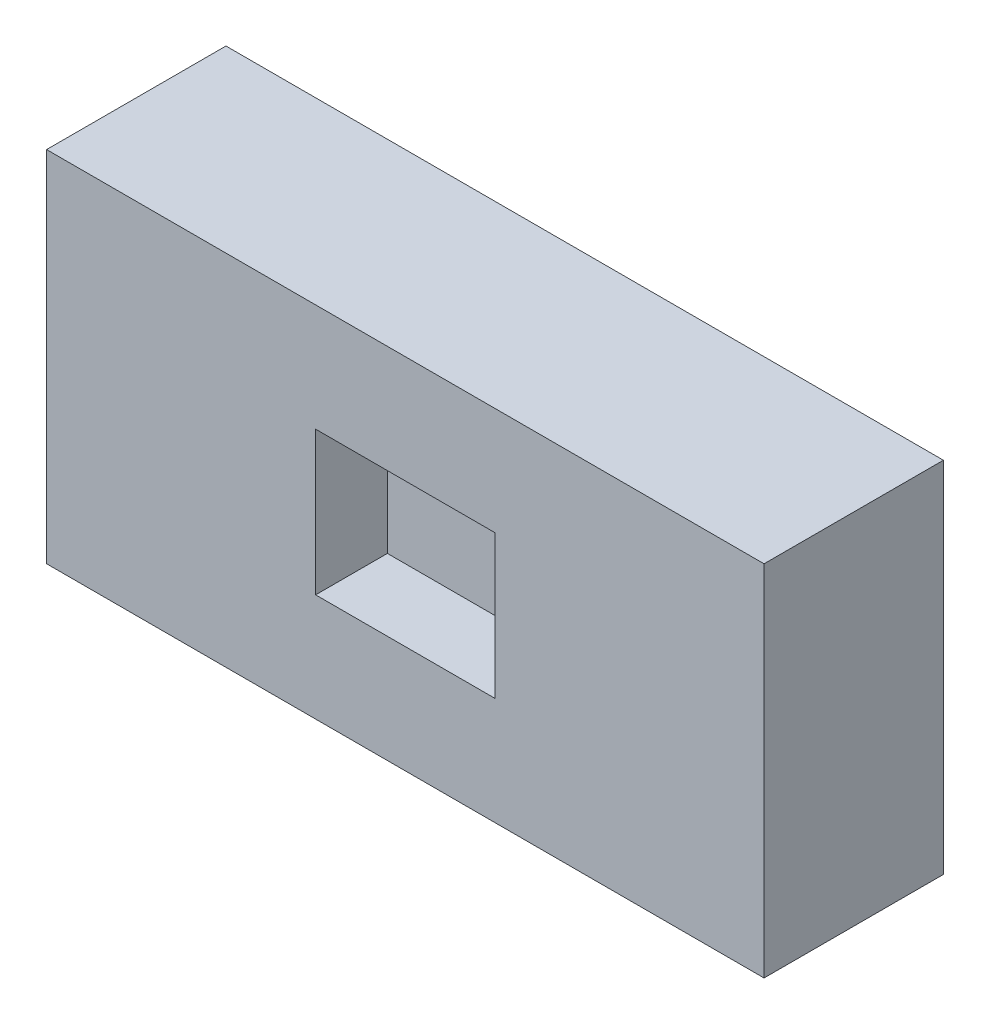
ISO-10303-21;
HEADER;
FILE_DESCRIPTION(('STEP AP214'),'2;1');
FILE_NAME('part.step','',(''),(''),'','','');
FILE_SCHEMA(('AUTOMOTIVE_DESIGN { 1 0 10303 214 1 1 1 1 }'));
ENDSEC;
DATA;
#1=APPLICATION_CONTEXT('core data for automotive mechanical design processes');
#2=APPLICATION_PROTOCOL_DEFINITION('international standard','automotive_design',2000,#1);
#3=PRODUCT_CONTEXT('',#1,'mechanical');
#4=PRODUCT('Part','Part','',(#3));
#5=PRODUCT_RELATED_PRODUCT_CATEGORY('part','',(#4));
#6=PRODUCT_DEFINITION_FORMATION('','',#4);
#7=PRODUCT_DEFINITION_CONTEXT('part definition',#1,'design');
#8=PRODUCT_DEFINITION('design','',#6,#7);
#9=PRODUCT_DEFINITION_SHAPE('','',#8);
#10=(LENGTH_UNIT() NAMED_UNIT(*) SI_UNIT(.MILLI.,.METRE.));
#11=(NAMED_UNIT(*) PLANE_ANGLE_UNIT() SI_UNIT($,.RADIAN.));
#12=(NAMED_UNIT(*) SI_UNIT($,.STERADIAN.) SOLID_ANGLE_UNIT());
#13=UNCERTAINTY_MEASURE_WITH_UNIT(LENGTH_MEASURE(1.E-05),#10,'distance_accuracy_value','');
#14=(GEOMETRIC_REPRESENTATION_CONTEXT(3) GLOBAL_UNCERTAINTY_ASSIGNED_CONTEXT((#13)) GLOBAL_UNIT_ASSIGNED_CONTEXT((#10,
#11,#12)) REPRESENTATION_CONTEXT('',''));
#15=CARTESIAN_POINT('',(0.,0.,0.));
#16=DIRECTION('',(0.,0.,1.));
#17=DIRECTION('',(1.,0.,0.));
#18=AXIS2_PLACEMENT_3D('',#15,#16,#17);
#19=CARTESIAN_POINT('',(0.,0.,10.));
#20=DIRECTION('',(1.,0.,0.));
#21=DIRECTION('',(0.,0.,-1.));
#22=AXIS2_PLACEMENT_3D('',#19,#20,#21);
#23=PLANE('',#22);
#24=DIRECTION('',(0.,-1.,0.));
#25=VECTOR('',#24,1.);
#26=CARTESIAN_POINT('',(0.,0.,0.));
#27=LINE('',#26,#25);
#28=CARTESIAN_POINT('',(0.,20.,0.));
#29=VERTEX_POINT('',#28);
#30=CARTESIAN_POINT('',(0.,0.,0.));
#31=VERTEX_POINT('',#30);
#32=EDGE_CURVE('E153',#29,#31,#27,.T.);
#33=ORIENTED_EDGE('',*,*,#32,.T.);
#34=DIRECTION('',(0.,0.,-1.));
#35=VECTOR('',#34,1.);
#36=CARTESIAN_POINT('',(0.,0.,10.));
#37=LINE('',#36,#35);
#38=CARTESIAN_POINT('',(0.,0.,10.));
#39=VERTEX_POINT('',#38);
#40=EDGE_CURVE('E11',#39,#31,#37,.T.);
#41=ORIENTED_EDGE('',*,*,#40,.F.);
#42=DIRECTION('',(0.,-1.,0.));
#43=VECTOR('',#42,1.);
#44=CARTESIAN_POINT('',(0.,0.,10.));
#45=LINE('',#44,#43);
#46=CARTESIAN_POINT('',(0.,20.,10.));
#47=VERTEX_POINT('',#46);
#48=EDGE_CURVE('E160',#47,#39,#45,.T.);
#49=ORIENTED_EDGE('',*,*,#48,.F.);
#50=DIRECTION('',(0.,0.,-1.));
#51=VECTOR('',#50,1.);
#52=CARTESIAN_POINT('',(0.,20.,10.));
#53=LINE('',#52,#51);
#54=EDGE_CURVE('E162',#47,#29,#53,.T.);
#55=ORIENTED_EDGE('',*,*,#54,.T.);
#56=EDGE_LOOP('',(#33,#41,#49,#55));
#57=FACE_BOUND('',#56,.T.);
#58=ADVANCED_FACE('F44',(#57),#23,.F.);
#59=CARTESIAN_POINT('',(0.,0.,10.));
#60=DIRECTION('',(0.,1.,0.));
#61=DIRECTION('',(0.,0.,1.));
#62=AXIS2_PLACEMENT_3D('',#59,#60,#61);
#63=PLANE('',#62);
#64=DIRECTION('',(1.,0.,0.));
#65=VECTOR('',#64,1.);
#66=CARTESIAN_POINT('',(0.,0.,0.));
#67=LINE('',#66,#65);
#68=CARTESIAN_POINT('',(40.,0.,0.));
#69=VERTEX_POINT('',#68);
#70=EDGE_CURVE('E167',#31,#69,#67,.T.);
#71=ORIENTED_EDGE('',*,*,#70,.T.);
#72=DIRECTION('',(0.,0.,-1.));
#73=VECTOR('',#72,1.);
#74=CARTESIAN_POINT('',(40.,0.,10.));
#75=LINE('',#74,#73);
#76=CARTESIAN_POINT('',(40.,0.,10.));
#77=VERTEX_POINT('',#76);
#78=EDGE_CURVE('E55',#77,#69,#75,.T.);
#79=ORIENTED_EDGE('',*,*,#78,.F.);
#80=DIRECTION('',(1.,0.,0.));
#81=VECTOR('',#80,1.);
#82=CARTESIAN_POINT('',(0.,0.,10.));
#83=LINE('',#82,#81);
#84=EDGE_CURVE('E96',#39,#77,#83,.T.);
#85=ORIENTED_EDGE('',*,*,#84,.F.);
#86=ORIENTED_EDGE('',*,*,#40,.T.);
#87=EDGE_LOOP('',(#71,#79,#85,#86));
#88=FACE_BOUND('',#87,.T.);
#89=ADVANCED_FACE('F198',(#88),#63,.F.);
#90=CARTESIAN_POINT('',(40.,0.,10.));
#91=DIRECTION('',(-1.,0.,0.));
#92=DIRECTION('',(0.,0.,1.));
#93=AXIS2_PLACEMENT_3D('',#90,#91,#92);
#94=PLANE('',#93);
#95=DIRECTION('',(0.,1.,0.));
#96=VECTOR('',#95,1.);
#97=CARTESIAN_POINT('',(40.,0.,0.));
#98=LINE('',#97,#96);
#99=CARTESIAN_POINT('',(40.,20.,0.));
#100=VERTEX_POINT('',#99);
#101=EDGE_CURVE('E169',#69,#100,#98,.T.);
#102=ORIENTED_EDGE('',*,*,#101,.T.);
#103=DIRECTION('',(0.,0.,-1.));
#104=VECTOR('',#103,1.);
#105=CARTESIAN_POINT('',(40.,20.,10.));
#106=LINE('',#105,#104);
#107=CARTESIAN_POINT('',(40.,20.,10.));
#108=VERTEX_POINT('',#107);
#109=EDGE_CURVE('E175',#108,#100,#106,.T.);
#110=ORIENTED_EDGE('',*,*,#109,.F.);
#111=DIRECTION('',(0.,1.,0.));
#112=VECTOR('',#111,1.);
#113=CARTESIAN_POINT('',(40.,0.,10.));
#114=LINE('',#113,#112);
#115=EDGE_CURVE('E159',#77,#108,#114,.T.);
#116=ORIENTED_EDGE('',*,*,#115,.F.);
#117=ORIENTED_EDGE('',*,*,#78,.T.);
#118=EDGE_LOOP('',(#102,#110,#116,#117));
#119=FACE_BOUND('',#118,.T.);
#120=ADVANCED_FACE('F177',(#119),#94,.F.);
#121=CARTESIAN_POINT('',(0.,20.,10.));
#122=DIRECTION('',(0.,-1.,0.));
#123=DIRECTION('',(0.,0.,-1.));
#124=AXIS2_PLACEMENT_3D('',#121,#122,#123);
#125=PLANE('',#124);
#126=DIRECTION('',(-1.,0.,0.));
#127=VECTOR('',#126,1.);
#128=CARTESIAN_POINT('',(0.,20.,0.));
#129=LINE('',#128,#127);
#130=EDGE_CURVE('E90',#100,#29,#129,.T.);
#131=ORIENTED_EDGE('',*,*,#130,.T.);
#132=ORIENTED_EDGE('',*,*,#54,.F.);
#133=DIRECTION('',(-1.,0.,0.));
#134=VECTOR('',#133,1.);
#135=CARTESIAN_POINT('',(0.,20.,10.));
#136=LINE('',#135,#134);
#137=EDGE_CURVE('E69',#108,#47,#136,.T.);
#138=ORIENTED_EDGE('',*,*,#137,.F.);
#139=ORIENTED_EDGE('',*,*,#109,.T.);
#140=EDGE_LOOP('',(#131,#132,#138,#139));
#141=FACE_BOUND('',#140,.T.);
#142=ADVANCED_FACE('F183',(#141),#125,.F.);
#143=CARTESIAN_POINT('',(0.,0.,10.));
#144=DIRECTION('',(0.,0.,-1.));
#145=DIRECTION('',(-1.,0.,0.));
#146=AXIS2_PLACEMENT_3D('',#143,#144,#145);
#147=PLANE('',#146);
#148=DIRECTION('',(1.,0.,0.));
#149=VECTOR('',#148,1.);
#150=CARTESIAN_POINT('',(15.,6.,10.));
#151=LINE('',#150,#149);
#152=CARTESIAN_POINT('',(15.,6.,10.));
#153=VERTEX_POINT('',#152);
#154=CARTESIAN_POINT('',(25.,6.,10.));
#155=VERTEX_POINT('',#154);
#156=EDGE_CURVE('E150',#153,#155,#151,.T.);
#157=ORIENTED_EDGE('',*,*,#156,.F.);
#158=DIRECTION('',(0.,-1.,0.));
#159=VECTOR('',#158,1.);
#160=CARTESIAN_POINT('',(15.,6.,10.));
#161=LINE('',#160,#159);
#162=CARTESIAN_POINT('',(15.,14.,10.));
#163=VERTEX_POINT('',#162);
#164=EDGE_CURVE('E56',#163,#153,#161,.T.);
#165=ORIENTED_EDGE('',*,*,#164,.F.);
#166=DIRECTION('',(-1.,0.,0.));
#167=VECTOR('',#166,1.);
#168=CARTESIAN_POINT('',(15.,14.,10.));
#169=LINE('',#168,#167);
#170=CARTESIAN_POINT('',(25.,14.,10.));
#171=VERTEX_POINT('',#170);
#172=EDGE_CURVE('E139',#171,#163,#169,.T.);
#173=ORIENTED_EDGE('',*,*,#172,.F.);
#174=DIRECTION('',(0.,1.,0.));
#175=VECTOR('',#174,1.);
#176=CARTESIAN_POINT('',(25.,6.,10.));
#177=LINE('',#176,#175);
#178=EDGE_CURVE('E143',#155,#171,#177,.T.);
#179=ORIENTED_EDGE('',*,*,#178,.F.);
#180=EDGE_LOOP('',(#157,#165,#173,#179));
#181=FACE_BOUND('',#180,.T.);
#182=ORIENTED_EDGE('',*,*,#48,.T.);
#183=ORIENTED_EDGE('',*,*,#84,.T.);
#184=ORIENTED_EDGE('',*,*,#115,.T.);
#185=ORIENTED_EDGE('',*,*,#137,.T.);
#186=EDGE_LOOP('',(#182,#183,#184,#185));
#187=FACE_BOUND('',#186,.T.);
#188=ADVANCED_FACE('F190',(#181,#187),#147,.F.);
#189=CARTESIAN_POINT('',(0.,0.,0.));
#190=DIRECTION('',(0.,0.,-1.));
#191=DIRECTION('',(-1.,0.,0.));
#192=AXIS2_PLACEMENT_3D('',#189,#190,#191);
#193=PLANE('',#192);
#194=ORIENTED_EDGE('',*,*,#32,.F.);
#195=ORIENTED_EDGE('',*,*,#130,.F.);
#196=ORIENTED_EDGE('',*,*,#101,.F.);
#197=ORIENTED_EDGE('',*,*,#70,.F.);
#198=EDGE_LOOP('',(#194,#195,#196,#197));
#199=FACE_BOUND('',#198,.T.);
#200=ADVANCED_FACE('F182',(#199),#193,.T.);
#201=CARTESIAN_POINT('',(15.,6.,6.));
#202=DIRECTION('',(-1.,0.,0.));
#203=DIRECTION('',(0.,0.,1.));
#204=AXIS2_PLACEMENT_3D('',#201,#202,#203);
#205=PLANE('',#204);
#206=ORIENTED_EDGE('',*,*,#164,.T.);
#207=DIRECTION('',(0.,0.,1.));
#208=VECTOR('',#207,1.);
#209=CARTESIAN_POINT('',(15.,6.,6.));
#210=LINE('',#209,#208);
#211=CARTESIAN_POINT('',(15.,6.,6.));
#212=VERTEX_POINT('',#211);
#213=EDGE_CURVE('E117',#212,#153,#210,.T.);
#214=ORIENTED_EDGE('',*,*,#213,.F.);
#215=DIRECTION('',(0.,-1.,0.));
#216=VECTOR('',#215,1.);
#217=CARTESIAN_POINT('',(15.,6.,6.));
#218=LINE('',#217,#216);
#219=CARTESIAN_POINT('',(15.,14.,6.));
#220=VERTEX_POINT('',#219);
#221=EDGE_CURVE('E118',#220,#212,#218,.T.);
#222=ORIENTED_EDGE('',*,*,#221,.F.);
#223=DIRECTION('',(0.,0.,1.));
#224=VECTOR('',#223,1.);
#225=CARTESIAN_POINT('',(15.,14.,6.));
#226=LINE('',#225,#224);
#227=EDGE_CURVE('E151',#220,#163,#226,.T.);
#228=ORIENTED_EDGE('',*,*,#227,.T.);
#229=EDGE_LOOP('',(#206,#214,#222,#228));
#230=FACE_BOUND('',#229,.T.);
#231=ADVANCED_FACE('F119',(#230),#205,.F.);
#232=CARTESIAN_POINT('',(15.,14.,6.));
#233=DIRECTION('',(0.,1.,0.));
#234=DIRECTION('',(0.,0.,1.));
#235=AXIS2_PLACEMENT_3D('',#232,#233,#234);
#236=PLANE('',#235);
#237=ORIENTED_EDGE('',*,*,#172,.T.);
#238=ORIENTED_EDGE('',*,*,#227,.F.);
#239=DIRECTION('',(-1.,0.,0.));
#240=VECTOR('',#239,1.);
#241=CARTESIAN_POINT('',(15.,14.,6.));
#242=LINE('',#241,#240);
#243=CARTESIAN_POINT('',(25.,14.,6.));
#244=VERTEX_POINT('',#243);
#245=EDGE_CURVE('E127',#244,#220,#242,.T.);
#246=ORIENTED_EDGE('',*,*,#245,.F.);
#247=DIRECTION('',(0.,0.,1.));
#248=VECTOR('',#247,1.);
#249=CARTESIAN_POINT('',(25.,14.,6.));
#250=LINE('',#249,#248);
#251=EDGE_CURVE('E152',#244,#171,#250,.T.);
#252=ORIENTED_EDGE('',*,*,#251,.T.);
#253=EDGE_LOOP('',(#237,#238,#246,#252));
#254=FACE_BOUND('',#253,.T.);
#255=ADVANCED_FACE('F240',(#254),#236,.F.);
#256=CARTESIAN_POINT('',(25.,6.,6.));
#257=DIRECTION('',(1.,0.,0.));
#258=DIRECTION('',(0.,0.,-1.));
#259=AXIS2_PLACEMENT_3D('',#256,#257,#258);
#260=PLANE('',#259);
#261=ORIENTED_EDGE('',*,*,#178,.T.);
#262=ORIENTED_EDGE('',*,*,#251,.F.);
#263=DIRECTION('',(0.,1.,0.));
#264=VECTOR('',#263,1.);
#265=CARTESIAN_POINT('',(25.,6.,6.));
#266=LINE('',#265,#264);
#267=CARTESIAN_POINT('',(25.,6.,6.));
#268=VERTEX_POINT('',#267);
#269=EDGE_CURVE('E131',#268,#244,#266,.T.);
#270=ORIENTED_EDGE('',*,*,#269,.F.);
#271=DIRECTION('',(0.,0.,1.));
#272=VECTOR('',#271,1.);
#273=CARTESIAN_POINT('',(25.,6.,6.));
#274=LINE('',#273,#272);
#275=EDGE_CURVE('E125',#268,#155,#274,.T.);
#276=ORIENTED_EDGE('',*,*,#275,.T.);
#277=EDGE_LOOP('',(#261,#262,#270,#276));
#278=FACE_BOUND('',#277,.T.);
#279=ADVANCED_FACE('F246',(#278),#260,.F.);
#280=CARTESIAN_POINT('',(15.,6.,6.));
#281=DIRECTION('',(0.,-1.,0.));
#282=DIRECTION('',(0.,0.,-1.));
#283=AXIS2_PLACEMENT_3D('',#280,#281,#282);
#284=PLANE('',#283);
#285=ORIENTED_EDGE('',*,*,#156,.T.);
#286=ORIENTED_EDGE('',*,*,#275,.F.);
#287=DIRECTION('',(1.,0.,0.));
#288=VECTOR('',#287,1.);
#289=CARTESIAN_POINT('',(15.,6.,6.));
#290=LINE('',#289,#288);
#291=EDGE_CURVE('E129',#212,#268,#290,.T.);
#292=ORIENTED_EDGE('',*,*,#291,.F.);
#293=ORIENTED_EDGE('',*,*,#213,.T.);
#294=EDGE_LOOP('',(#285,#286,#292,#293));
#295=FACE_BOUND('',#294,.T.);
#296=ADVANCED_FACE('F128',(#295),#284,.F.);
#297=CARTESIAN_POINT('',(0.,0.,6.));
#298=DIRECTION('',(0.,0.,-1.));
#299=DIRECTION('',(-1.,0.,0.));
#300=AXIS2_PLACEMENT_3D('',#297,#298,#299);
#301=PLANE('',#300);
#302=ORIENTED_EDGE('',*,*,#221,.T.);
#303=ORIENTED_EDGE('',*,*,#291,.T.);
#304=ORIENTED_EDGE('',*,*,#269,.T.);
#305=ORIENTED_EDGE('',*,*,#245,.T.);
#306=EDGE_LOOP('',(#302,#303,#304,#305));
#307=FACE_BOUND('',#306,.T.);
#308=ADVANCED_FACE('F136',(#307),#301,.F.);
#309=CLOSED_SHELL('',(#58,#89,#120,#142,#188,#200,#231,#255,#279,#296,#308));
#310=MANIFOLD_SOLID_BREP('B2',#309);
#311=ADVANCED_BREP_SHAPE_REPRESENTATION('',(#18,#310),#14);
#312=SHAPE_DEFINITION_REPRESENTATION(#9,#311);
ENDSEC;
END-ISO-10303-21;
